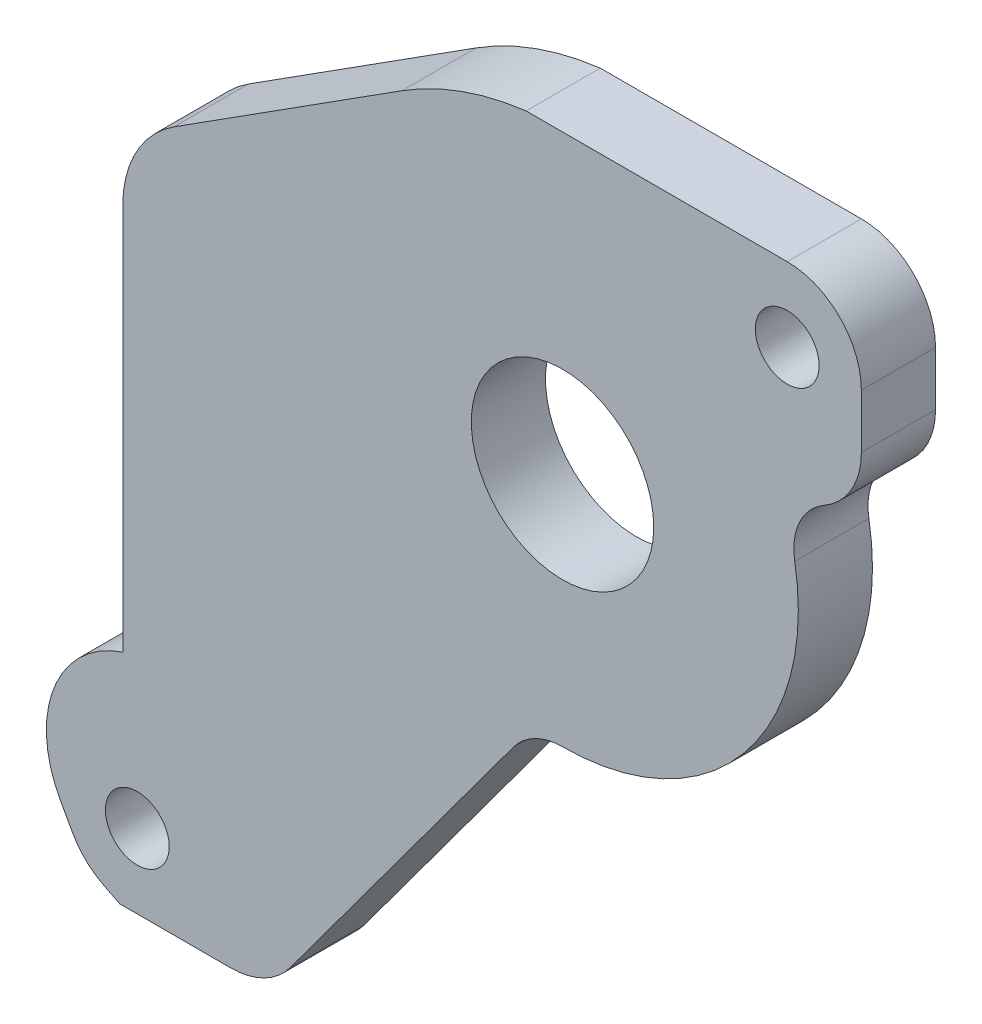
ISO-10303-21;
HEADER;
FILE_DESCRIPTION(('STEP AP214'),'2;1');
FILE_NAME('part.step','',(''),(''),'','','');
FILE_SCHEMA(('AUTOMOTIVE_DESIGN { 1 0 10303 214 1 1 1 1 }'));
ENDSEC;
DATA;
#1=APPLICATION_CONTEXT('core data for automotive mechanical design processes');
#2=APPLICATION_PROTOCOL_DEFINITION('international standard','automotive_design',2000,#1);
#3=PRODUCT_CONTEXT('',#1,'mechanical');
#4=PRODUCT('Part','Part','',(#3));
#5=PRODUCT_RELATED_PRODUCT_CATEGORY('part','',(#4));
#6=PRODUCT_DEFINITION_FORMATION('','',#4);
#7=PRODUCT_DEFINITION_CONTEXT('part definition',#1,'design');
#8=PRODUCT_DEFINITION('design','',#6,#7);
#9=PRODUCT_DEFINITION_SHAPE('','',#8);
#10=(LENGTH_UNIT() NAMED_UNIT(*) SI_UNIT(.MILLI.,.METRE.));
#11=(NAMED_UNIT(*) PLANE_ANGLE_UNIT() SI_UNIT($,.RADIAN.));
#12=(NAMED_UNIT(*) SI_UNIT($,.STERADIAN.) SOLID_ANGLE_UNIT());
#13=UNCERTAINTY_MEASURE_WITH_UNIT(LENGTH_MEASURE(1.E-05),#10,'distance_accuracy_value','');
#14=(GEOMETRIC_REPRESENTATION_CONTEXT(3) GLOBAL_UNCERTAINTY_ASSIGNED_CONTEXT((#13)) GLOBAL_UNIT_ASSIGNED_CONTEXT((#10,
#11,#12)) REPRESENTATION_CONTEXT('',''));
#15=CARTESIAN_POINT('',(0.,0.,0.));
#16=DIRECTION('',(0.,0.,1.));
#17=DIRECTION('',(1.,0.,0.));
#18=AXIS2_PLACEMENT_3D('',#15,#16,#17);
#19=CARTESIAN_POINT('',(0.,0.,5.));
#20=DIRECTION('',(0.,0.,1.));
#21=DIRECTION('',(1.,0.,0.));
#22=AXIS2_PLACEMENT_3D('',#19,#20,#21);
#23=PLANE('',#22);
#24=CARTESIAN_POINT('',(19.6961550602442,13.4729635533387,5.));
#25=DIRECTION('',(0.,0.,1.));
#26=DIRECTION('',(1.,0.,0.));
#27=AXIS2_PLACEMENT_3D('',#24,#25,#26);
#28=CIRCLE('',#27,4.1);
#29=CARTESIAN_POINT('',(17.6478873957385,17.0246673099238,5.));
#30=VERTEX_POINT('',#29);
#31=CARTESIAN_POINT('',(15.6584432728941,12.7610060249042,5.));
#32=VERTEX_POINT('',#31);
#33=EDGE_CURVE('E202',#30,#32,#28,.T.);
#34=ORIENTED_EDGE('',*,*,#33,.F.);
#35=CARTESIAN_POINT('',(15.15,21.3560133545398,5.));
#36=DIRECTION('',(0.,0.,1.));
#37=DIRECTION('',(1.,0.,0.));
#38=AXIS2_PLACEMENT_3D('',#35,#36,#37);
#39=CIRCLE('',#38,5.);
#40=CARTESIAN_POINT('',(20.15,21.3560133545398,5.));
#41=VERTEX_POINT('',#40);
#42=EDGE_CURVE('E71',#30,#41,#39,.T.);
#43=ORIENTED_EDGE('',*,*,#42,.T.);
#44=DIRECTION('',(0.,-1.,0.));
#45=VECTOR('',#44,1.);
#46=CARTESIAN_POINT('',(20.15,0.,5.));
#47=LINE('',#46,#45);
#48=CARTESIAN_POINT('',(20.15,25.,5.));
#49=VERTEX_POINT('',#48);
#50=EDGE_CURVE('E286',#49,#41,#47,.T.);
#51=ORIENTED_EDGE('',*,*,#50,.F.);
#52=CARTESIAN_POINT('',(15.15,25.,5.));
#53=DIRECTION('',(0.,0.,1.));
#54=DIRECTION('',(1.,0.,0.));
#55=AXIS2_PLACEMENT_3D('',#52,#53,#54);
#56=CIRCLE('',#55,5.);
#57=CARTESIAN_POINT('',(15.15,30.,5.));
#58=VERTEX_POINT('',#57);
#59=EDGE_CURVE('E267',#49,#58,#56,.T.);
#60=ORIENTED_EDGE('',*,*,#59,.T.);
#61=DIRECTION('',(1.,0.,0.));
#62=VECTOR('',#61,1.);
#63=CARTESIAN_POINT('',(0.,30.,5.));
#64=LINE('',#63,#62);
#65=CARTESIAN_POINT('',(-2.45407823836146,30.,5.));
#66=VERTEX_POINT('',#65);
#67=EDGE_CURVE('E288',#66,#58,#64,.T.);
#68=ORIENTED_EDGE('',*,*,#67,.F.);
#69=CARTESIAN_POINT('',(0.,9.99999999999999,5.));
#70=DIRECTION('',(0.,0.,1.));
#71=DIRECTION('',(1.,0.,0.));
#72=AXIS2_PLACEMENT_3D('',#69,#70,#71);
#73=CIRCLE('',#72,20.15);
#74=CARTESIAN_POINT('',(-10.828193198281,26.9933143341933,5.));
#75=VERTEX_POINT('',#74);
#76=EDGE_CURVE('E213',#66,#75,#73,.T.);
#77=ORIENTED_EDGE('',*,*,#76,.T.);
#78=DIRECTION('',(0.843340661746567,0.537379315051168,0.));
#79=VECTOR('',#78,1.);
#80=CARTESIAN_POINT('',(-15.3601314699227,24.1055490517447,5.));
#81=LINE('',#80,#79);
#82=CARTESIAN_POINT('',(-26.1803448628838,17.2108751369652,5.));
#83=VERTEX_POINT('',#82);
#84=EDGE_CURVE('E220',#83,#75,#81,.T.);
#85=ORIENTED_EDGE('',*,*,#84,.F.);
#86=CARTESIAN_POINT('',(-22.15,10.885820173866,5.));
#87=DIRECTION('',(0.,0.,1.));
#88=DIRECTION('',(1.,0.,0.));
#89=AXIS2_PLACEMENT_3D('',#86,#87,#88);
#90=CIRCLE('',#89,7.5);
#91=CARTESIAN_POINT('',(-29.65,10.885820173866,5.));
#92=VERTEX_POINT('',#91);
#93=EDGE_CURVE('E297',#83,#92,#90,.T.);
#94=ORIENTED_EDGE('',*,*,#93,.T.);
#95=DIRECTION('',(0.,-1.,0.));
#96=VECTOR('',#95,1.);
#97=CARTESIAN_POINT('',(-29.65,0.,5.));
#98=LINE('',#97,#96);
#99=CARTESIAN_POINT('',(-29.65,-15.2,5.));
#100=VERTEX_POINT('',#99);
#101=EDGE_CURVE('E237',#92,#100,#98,.T.);
#102=ORIENTED_EDGE('',*,*,#101,.T.);
#103=CARTESIAN_POINT('',(-27.2993967453016,-22.3221249876003,5.));
#104=DIRECTION('',(0.,0.,1.));
#105=DIRECTION('',(1.,0.,0.));
#106=AXIS2_PLACEMENT_3D('',#103,#104,#105);
#107=CIRCLE('',#106,7.5);
#108=CARTESIAN_POINT('',(-33.8519109527962,-25.9710368199938,5.));
#109=VERTEX_POINT('',#108);
#110=EDGE_CURVE('E307',#100,#109,#107,.T.);
#111=ORIENTED_EDGE('',*,*,#110,.T.);
#112=DIRECTION('',(0.486521577652461,-0.873668560999285,0.));
#113=VECTOR('',#112,1.);
#114=CARTESIAN_POINT('',(-36.8782664869401,-20.5364748066386,5.));
#115=LINE('',#114,#113);
#116=CARTESIAN_POINT('',(-33.0380029174975,-27.4326078882623,5.));
#117=VERTEX_POINT('',#116);
#118=EDGE_CURVE('E235',#109,#117,#115,.T.);
#119=ORIENTED_EDGE('',*,*,#118,.T.);
#120=CARTESIAN_POINT('',(-28.6696601125011,-25.,5.));
#121=DIRECTION('',(0.,0.,1.));
#122=DIRECTION('',(1.,0.,0.));
#123=AXIS2_PLACEMENT_3D('',#120,#121,#122);
#124=CIRCLE('',#123,5.);
#125=CARTESIAN_POINT('',(-30.9057280900008,-29.4721359549996,5.));
#126=VERTEX_POINT('',#125);
#127=EDGE_CURVE('E232',#117,#126,#124,.T.);
#128=ORIENTED_EDGE('',*,*,#127,.T.);
#129=DIRECTION('',(0.894427190999916,-0.447213595499958,0.));
#130=VECTOR('',#129,1.);
#131=CARTESIAN_POINT('',(-17.97,-35.94,5.));
#132=LINE('',#131,#130);
#133=CARTESIAN_POINT('',(-29.85,-30.,5.));
#134=VERTEX_POINT('',#133);
#135=EDGE_CURVE('E258',#126,#134,#132,.T.);
#136=ORIENTED_EDGE('',*,*,#135,.T.);
#137=DIRECTION('',(1.,0.,0.));
#138=VECTOR('',#137,1.);
#139=CARTESIAN_POINT('',(0.,-30.,5.));
#140=LINE('',#139,#138);
#141=CARTESIAN_POINT('',(-22.3746953353688,-30.,5.));
#142=VERTEX_POINT('',#141);
#143=EDGE_CURVE('E291',#134,#142,#140,.T.);
#144=ORIENTED_EDGE('',*,*,#143,.T.);
#145=CARTESIAN_POINT('',(-22.3746953353688,-25.,5.));
#146=DIRECTION('',(0.,0.,1.));
#147=DIRECTION('',(1.,0.,0.));
#148=AXIS2_PLACEMENT_3D('',#145,#146,#147);
#149=CIRCLE('',#148,5.);
#150=CARTESIAN_POINT('',(-18.3511593314807,-27.968359483859,5.));
#151=VERTEX_POINT('',#150);
#152=EDGE_CURVE('E323',#142,#151,#149,.T.);
#153=ORIENTED_EDGE('',*,*,#152,.T.);
#154=DIRECTION('',(0.593671896771801,0.804707200777632,0.));
#155=VECTOR('',#154,1.);
#156=CARTESIAN_POINT('',(1.47802097912755,-1.0904084334019,5.));
#157=LINE('',#156,#155);
#158=CARTESIAN_POINT('',(-3.29929952318829,-7.56594522323563,5.));
#159=VERTEX_POINT('',#158);
#160=EDGE_CURVE('E208',#151,#159,#157,.T.);
#161=ORIENTED_EDGE('',*,*,#160,.T.);
#162=CARTESIAN_POINT('',(0.,-10.,5.));
#163=DIRECTION('',(0.,0.,1.));
#164=DIRECTION('',(1.,0.,0.));
#165=AXIS2_PLACEMENT_3D('',#162,#163,#164);
#166=CIRCLE('',#165,4.1);
#167=CARTESIAN_POINT('',(0.,-5.90000000000001,5.));
#168=VERTEX_POINT('',#167);
#169=EDGE_CURVE('E193',#168,#159,#166,.T.);
#170=ORIENTED_EDGE('',*,*,#169,.F.);
#171=CARTESIAN_POINT('',(0.,9.99999999999999,5.));
#172=DIRECTION('',(0.,0.,1.));
#173=DIRECTION('',(1.,0.,0.));
#174=AXIS2_PLACEMENT_3D('',#171,#172,#173);
#175=CIRCLE('',#174,15.9);
#176=EDGE_CURVE('E199',#168,#32,#175,.T.);
#177=ORIENTED_EDGE('',*,*,#176,.T.);
#178=EDGE_LOOP('',(#34,#43,#51,#60,#68,#77,#85,#94,#102,#111,#119,#128,#136,#144,#153,#161,#170,#177));
#179=FACE_BOUND('',#178,.T.);
#180=CARTESIAN_POINT('',(0.,9.99999999999999,5.));
#181=DIRECTION('',(0.,0.,1.));
#182=DIRECTION('',(1.,0.,0.));
#183=AXIS2_PLACEMENT_3D('',#180,#181,#182);
#184=CIRCLE('',#183,6.15);
#185=CARTESIAN_POINT('',(6.15,9.99999999999999,5.));
#186=VERTEX_POINT('',#185);
#187=EDGE_CURVE('E294',#186,#186,#184,.T.);
#188=ORIENTED_EDGE('',*,*,#187,.F.);
#189=EDGE_LOOP('',(#188));
#190=FACE_BOUND('',#189,.T.);
#191=CARTESIAN_POINT('',(15.15,25.,5.));
#192=DIRECTION('',(0.,0.,1.));
#193=DIRECTION('',(1.,0.,0.));
#194=AXIS2_PLACEMENT_3D('',#191,#192,#193);
#195=CIRCLE('',#194,2.15);
#196=CARTESIAN_POINT('',(17.3,25.,5.));
#197=VERTEX_POINT('',#196);
#198=EDGE_CURVE('E277',#197,#197,#195,.T.);
#199=ORIENTED_EDGE('',*,*,#198,.F.);
#200=EDGE_LOOP('',(#199));
#201=FACE_BOUND('',#200,.T.);
#202=CARTESIAN_POINT('',(-28.6696601125011,-25.,5.));
#203=DIRECTION('',(0.,0.,1.));
#204=DIRECTION('',(1.,0.,0.));
#205=AXIS2_PLACEMENT_3D('',#202,#203,#204);
#206=CIRCLE('',#205,2.15);
#207=CARTESIAN_POINT('',(-26.5196601125011,-25.,5.));
#208=VERTEX_POINT('',#207);
#209=EDGE_CURVE('E244',#208,#208,#206,.T.);
#210=ORIENTED_EDGE('',*,*,#209,.F.);
#211=EDGE_LOOP('',(#210));
#212=FACE_BOUND('',#211,.T.);
#213=ADVANCED_FACE('F49',(#179,#190,#201,#212),#23,.T.);
#214=CARTESIAN_POINT('',(0.,0.,0.));
#215=DIRECTION('',(0.,0.,1.));
#216=DIRECTION('',(1.,0.,0.));
#217=AXIS2_PLACEMENT_3D('',#214,#215,#216);
#218=PLANE('',#217);
#219=CARTESIAN_POINT('',(0.,9.99999999999999,0.));
#220=DIRECTION('',(0.,0.,1.));
#221=DIRECTION('',(1.,0.,0.));
#222=AXIS2_PLACEMENT_3D('',#219,#220,#221);
#223=CIRCLE('',#222,6.15);
#224=CARTESIAN_POINT('',(6.15,9.99999999999999,0.));
#225=VERTEX_POINT('',#224);
#226=EDGE_CURVE('E289',#225,#225,#223,.T.);
#227=ORIENTED_EDGE('',*,*,#226,.T.);
#228=EDGE_LOOP('',(#227));
#229=FACE_BOUND('',#228,.T.);
#230=CARTESIAN_POINT('',(15.15,25.,0.));
#231=DIRECTION('',(0.,0.,1.));
#232=DIRECTION('',(1.,0.,0.));
#233=AXIS2_PLACEMENT_3D('',#230,#231,#232);
#234=CIRCLE('',#233,2.15);
#235=CARTESIAN_POINT('',(17.3,25.,0.));
#236=VERTEX_POINT('',#235);
#237=EDGE_CURVE('E280',#236,#236,#234,.T.);
#238=ORIENTED_EDGE('',*,*,#237,.T.);
#239=EDGE_LOOP('',(#238));
#240=FACE_BOUND('',#239,.T.);
#241=CARTESIAN_POINT('',(-28.6696601125011,-25.,0.));
#242=DIRECTION('',(0.,0.,1.));
#243=DIRECTION('',(1.,0.,0.));
#244=AXIS2_PLACEMENT_3D('',#241,#242,#243);
#245=CIRCLE('',#244,2.15);
#246=CARTESIAN_POINT('',(-26.5196601125011,-25.,0.));
#247=VERTEX_POINT('',#246);
#248=EDGE_CURVE('E255',#247,#247,#245,.T.);
#249=ORIENTED_EDGE('',*,*,#248,.T.);
#250=EDGE_LOOP('',(#249));
#251=FACE_BOUND('',#250,.T.);
#252=DIRECTION('',(0.,-1.,0.));
#253=VECTOR('',#252,1.);
#254=CARTESIAN_POINT('',(20.15,0.,0.));
#255=LINE('',#254,#253);
#256=CARTESIAN_POINT('',(20.15,25.,0.));
#257=VERTEX_POINT('',#256);
#258=CARTESIAN_POINT('',(20.15,21.3560133545398,0.));
#259=VERTEX_POINT('',#258);
#260=EDGE_CURVE('E283',#257,#259,#255,.T.);
#261=ORIENTED_EDGE('',*,*,#260,.T.);
#262=CARTESIAN_POINT('',(15.15,21.3560133545398,0.));
#263=DIRECTION('',(0.,0.,1.));
#264=DIRECTION('',(1.,0.,0.));
#265=AXIS2_PLACEMENT_3D('',#262,#263,#264);
#266=CIRCLE('',#265,5.);
#267=CARTESIAN_POINT('',(17.6478873957385,17.0246673099238,0.));
#268=VERTEX_POINT('',#267);
#269=EDGE_CURVE('E12',#259,#268,#266,.F.);
#270=ORIENTED_EDGE('',*,*,#269,.T.);
#271=CARTESIAN_POINT('',(19.6961550602442,13.4729635533387,0.));
#272=DIRECTION('',(0.,0.,1.));
#273=DIRECTION('',(1.,0.,0.));
#274=AXIS2_PLACEMENT_3D('',#271,#272,#273);
#275=CIRCLE('',#274,4.1);
#276=CARTESIAN_POINT('',(15.6584432728941,12.7610060249042,0.));
#277=VERTEX_POINT('',#276);
#278=EDGE_CURVE('E185',#268,#277,#275,.T.);
#279=ORIENTED_EDGE('',*,*,#278,.T.);
#280=CARTESIAN_POINT('',(0.,9.99999999999999,0.));
#281=DIRECTION('',(0.,0.,1.));
#282=DIRECTION('',(1.,0.,0.));
#283=AXIS2_PLACEMENT_3D('',#280,#281,#282);
#284=CIRCLE('',#283,15.9);
#285=CARTESIAN_POINT('',(0.,-5.90000000000001,0.));
#286=VERTEX_POINT('',#285);
#287=EDGE_CURVE('E195',#286,#277,#284,.T.);
#288=ORIENTED_EDGE('',*,*,#287,.F.);
#289=CARTESIAN_POINT('',(0.,-10.,0.));
#290=DIRECTION('',(0.,0.,1.));
#291=DIRECTION('',(1.,0.,0.));
#292=AXIS2_PLACEMENT_3D('',#289,#290,#291);
#293=CIRCLE('',#292,4.1);
#294=CARTESIAN_POINT('',(-3.29929952318829,-7.56594522323563,0.));
#295=VERTEX_POINT('',#294);
#296=EDGE_CURVE('E186',#286,#295,#293,.T.);
#297=ORIENTED_EDGE('',*,*,#296,.T.);
#298=DIRECTION('',(0.593671896771801,0.804707200777632,0.));
#299=VECTOR('',#298,1.);
#300=CARTESIAN_POINT('',(1.47802097912755,-1.0904084334019,0.));
#301=LINE('',#300,#299);
#302=CARTESIAN_POINT('',(-18.3511593314807,-27.968359483859,0.));
#303=VERTEX_POINT('',#302);
#304=EDGE_CURVE('E174',#303,#295,#301,.T.);
#305=ORIENTED_EDGE('',*,*,#304,.F.);
#306=CARTESIAN_POINT('',(-22.3746953353688,-25.,0.));
#307=DIRECTION('',(0.,0.,1.));
#308=DIRECTION('',(1.,0.,0.));
#309=AXIS2_PLACEMENT_3D('',#306,#307,#308);
#310=CIRCLE('',#309,5.);
#311=CARTESIAN_POINT('',(-22.3746953353688,-30.,0.));
#312=VERTEX_POINT('',#311);
#313=EDGE_CURVE('E326',#303,#312,#310,.F.);
#314=ORIENTED_EDGE('',*,*,#313,.T.);
#315=DIRECTION('',(1.,0.,0.));
#316=VECTOR('',#315,1.);
#317=CARTESIAN_POINT('',(0.,-30.,0.));
#318=LINE('',#317,#316);
#319=CARTESIAN_POINT('',(-29.85,-30.,0.));
#320=VERTEX_POINT('',#319);
#321=EDGE_CURVE('E301',#320,#312,#318,.T.);
#322=ORIENTED_EDGE('',*,*,#321,.F.);
#323=DIRECTION('',(0.894427190999916,-0.447213595499958,0.));
#324=VECTOR('',#323,1.);
#325=CARTESIAN_POINT('',(-17.97,-35.94,0.));
#326=LINE('',#325,#324);
#327=CARTESIAN_POINT('',(-30.9057280900009,-29.4721359549996,0.));
#328=VERTEX_POINT('',#327);
#329=EDGE_CURVE('E261',#328,#320,#326,.T.);
#330=ORIENTED_EDGE('',*,*,#329,.F.);
#331=CARTESIAN_POINT('',(-28.6696601125011,-25.,0.));
#332=DIRECTION('',(0.,0.,1.));
#333=DIRECTION('',(1.,0.,0.));
#334=AXIS2_PLACEMENT_3D('',#331,#332,#333);
#335=CIRCLE('',#334,5.);
#336=CARTESIAN_POINT('',(-33.0380029174975,-27.4326078882623,0.));
#337=VERTEX_POINT('',#336);
#338=EDGE_CURVE('E219',#337,#328,#335,.T.);
#339=ORIENTED_EDGE('',*,*,#338,.F.);
#340=DIRECTION('',(0.486521577652461,-0.873668560999285,0.));
#341=VECTOR('',#340,1.);
#342=CARTESIAN_POINT('',(-36.8782664869401,-20.5364748066386,0.));
#343=LINE('',#342,#341);
#344=CARTESIAN_POINT('',(-33.8519109527962,-25.9710368199938,0.));
#345=VERTEX_POINT('',#344);
#346=EDGE_CURVE('E222',#345,#337,#343,.T.);
#347=ORIENTED_EDGE('',*,*,#346,.F.);
#348=CARTESIAN_POINT('',(-27.2993967453016,-22.3221249876003,0.));
#349=DIRECTION('',(0.,0.,1.));
#350=DIRECTION('',(1.,0.,0.));
#351=AXIS2_PLACEMENT_3D('',#348,#349,#350);
#352=CIRCLE('',#351,7.5);
#353=CARTESIAN_POINT('',(-29.65,-15.2,0.));
#354=VERTEX_POINT('',#353);
#355=EDGE_CURVE('E313',#345,#354,#352,.F.);
#356=ORIENTED_EDGE('',*,*,#355,.T.);
#357=DIRECTION('',(0.,-1.,0.));
#358=VECTOR('',#357,1.);
#359=CARTESIAN_POINT('',(-29.65,0.,0.));
#360=LINE('',#359,#358);
#361=CARTESIAN_POINT('',(-29.65,10.885820173866,0.));
#362=VERTEX_POINT('',#361);
#363=EDGE_CURVE('E224',#362,#354,#360,.T.);
#364=ORIENTED_EDGE('',*,*,#363,.F.);
#365=CARTESIAN_POINT('',(-22.15,10.885820173866,0.));
#366=DIRECTION('',(0.,0.,1.));
#367=DIRECTION('',(1.,0.,0.));
#368=AXIS2_PLACEMENT_3D('',#365,#366,#367);
#369=CIRCLE('',#368,7.5);
#370=CARTESIAN_POINT('',(-26.1803448628838,17.2108751369652,0.));
#371=VERTEX_POINT('',#370);
#372=EDGE_CURVE('E311',#362,#371,#369,.F.);
#373=ORIENTED_EDGE('',*,*,#372,.T.);
#374=DIRECTION('',(0.843340661746567,0.537379315051168,0.));
#375=VECTOR('',#374,1.);
#376=CARTESIAN_POINT('',(-15.3601314699227,24.1055490517447,0.));
#377=LINE('',#376,#375);
#378=CARTESIAN_POINT('',(-10.828193198281,26.9933143341933,0.));
#379=VERTEX_POINT('',#378);
#380=EDGE_CURVE('E227',#371,#379,#377,.T.);
#381=ORIENTED_EDGE('',*,*,#380,.T.);
#382=CARTESIAN_POINT('',(0.,9.99999999999999,0.));
#383=DIRECTION('',(0.,0.,1.));
#384=DIRECTION('',(1.,0.,0.));
#385=AXIS2_PLACEMENT_3D('',#382,#383,#384);
#386=CIRCLE('',#385,20.15);
#387=CARTESIAN_POINT('',(-2.45407823836146,30.,0.));
#388=VERTEX_POINT('',#387);
#389=EDGE_CURVE('E216',#388,#379,#386,.T.);
#390=ORIENTED_EDGE('',*,*,#389,.F.);
#391=DIRECTION('',(1.,0.,0.));
#392=VECTOR('',#391,1.);
#393=CARTESIAN_POINT('',(0.,30.,0.));
#394=LINE('',#393,#392);
#395=CARTESIAN_POINT('',(15.15,30.,0.));
#396=VERTEX_POINT('',#395);
#397=EDGE_CURVE('E299',#388,#396,#394,.T.);
#398=ORIENTED_EDGE('',*,*,#397,.T.);
#399=CARTESIAN_POINT('',(15.15,25.,0.));
#400=DIRECTION('',(0.,0.,1.));
#401=DIRECTION('',(1.,0.,0.));
#402=AXIS2_PLACEMENT_3D('',#399,#400,#401);
#403=CIRCLE('',#402,5.);
#404=EDGE_CURVE('E268',#257,#396,#403,.T.);
#405=ORIENTED_EDGE('',*,*,#404,.F.);
#406=EDGE_LOOP('',(#261,#270,#279,#288,#297,#305,#314,#322,#330,#339,#347,#356,#364,#373,#381,
#390,#398,#405));
#407=FACE_BOUND('',#406,.T.);
#408=ADVANCED_FACE('F197',(#229,#240,#251,#407),#218,.F.);
#409=CARTESIAN_POINT('',(0.,30.,5.));
#410=DIRECTION('',(0.,1.,0.));
#411=DIRECTION('',(0.,0.,1.));
#412=AXIS2_PLACEMENT_3D('',#409,#410,#411);
#413=PLANE('',#412);
#414=ORIENTED_EDGE('',*,*,#397,.F.);
#415=DIRECTION('',(0.,0.,1.));
#416=VECTOR('',#415,1.);
#417=CARTESIAN_POINT('',(-2.45407823836146,30.,0.));
#418=LINE('',#417,#416);
#419=EDGE_CURVE('E229',#388,#66,#418,.T.);
#420=ORIENTED_EDGE('',*,*,#419,.T.);
#421=ORIENTED_EDGE('',*,*,#67,.T.);
#422=DIRECTION('',(0.,0.,1.));
#423=VECTOR('',#422,1.);
#424=CARTESIAN_POINT('',(15.15,30.,0.));
#425=LINE('',#424,#423);
#426=EDGE_CURVE('E274',#396,#58,#425,.T.);
#427=ORIENTED_EDGE('',*,*,#426,.F.);
#428=EDGE_LOOP('',(#414,#420,#421,#427));
#429=FACE_BOUND('',#428,.T.);
#430=ADVANCED_FACE('F356',(#429),#413,.T.);
#431=CARTESIAN_POINT('',(0.,-30.,5.));
#432=DIRECTION('',(0.,1.,0.));
#433=DIRECTION('',(0.,0.,1.));
#434=AXIS2_PLACEMENT_3D('',#431,#432,#433);
#435=PLANE('',#434);
#436=ORIENTED_EDGE('',*,*,#321,.T.);
#437=DIRECTION('',(0.,0.,1.));
#438=VECTOR('',#437,1.);
#439=CARTESIAN_POINT('',(-22.3746953353688,-30.,5.));
#440=LINE('',#439,#438);
#441=EDGE_CURVE('E320',#312,#142,#440,.T.);
#442=ORIENTED_EDGE('',*,*,#441,.T.);
#443=ORIENTED_EDGE('',*,*,#143,.F.);
#444=DIRECTION('',(0.,0.,1.));
#445=VECTOR('',#444,1.);
#446=CARTESIAN_POINT('',(-29.85,-30.,0.));
#447=LINE('',#446,#445);
#448=EDGE_CURVE('E263',#320,#134,#447,.T.);
#449=ORIENTED_EDGE('',*,*,#448,.F.);
#450=EDGE_LOOP('',(#436,#442,#443,#449));
#451=FACE_BOUND('',#450,.T.);
#452=ADVANCED_FACE('F368',(#451),#435,.F.);
#453=CARTESIAN_POINT('',(20.15,0.,5.));
#454=DIRECTION('',(1.,0.,0.));
#455=DIRECTION('',(0.,1.,0.));
#456=AXIS2_PLACEMENT_3D('',#453,#454,#455);
#457=PLANE('',#456);
#458=ORIENTED_EDGE('',*,*,#50,.T.);
#459=DIRECTION('',(0.,0.,-1.));
#460=VECTOR('',#459,1.);
#461=CARTESIAN_POINT('',(20.15,21.3560133545398,0.));
#462=LINE('',#461,#460);
#463=EDGE_CURVE('E57',#41,#259,#462,.T.);
#464=ORIENTED_EDGE('',*,*,#463,.T.);
#465=ORIENTED_EDGE('',*,*,#260,.F.);
#466=DIRECTION('',(0.,0.,1.));
#467=VECTOR('',#466,1.);
#468=CARTESIAN_POINT('',(20.15,25.,0.));
#469=LINE('',#468,#467);
#470=EDGE_CURVE('E271',#257,#49,#469,.T.);
#471=ORIENTED_EDGE('',*,*,#470,.T.);
#472=EDGE_LOOP('',(#458,#464,#465,#471));
#473=FACE_BOUND('',#472,.T.);
#474=ADVANCED_FACE('F366',(#473),#457,.T.);
#475=CARTESIAN_POINT('',(0.,9.99999999999999,5.));
#476=DIRECTION('',(0.,0.,-1.));
#477=DIRECTION('',(-1.,0.,0.));
#478=AXIS2_PLACEMENT_3D('',#475,#476,#477);
#479=CYLINDRICAL_SURFACE('',#478,6.15);
#480=ORIENTED_EDGE('',*,*,#187,.T.);
#481=EDGE_LOOP('',(#480));
#482=FACE_BOUND('',#481,.T.);
#483=ORIENTED_EDGE('',*,*,#226,.F.);
#484=EDGE_LOOP('',(#483));
#485=FACE_BOUND('',#484,.T.);
#486=ADVANCED_FACE('F363',(#482,#485),#479,.F.);
#487=CARTESIAN_POINT('',(15.15,25.,0.));
#488=DIRECTION('',(0.,0.,1.));
#489=DIRECTION('',(1.,0.,0.));
#490=AXIS2_PLACEMENT_3D('',#487,#488,#489);
#491=CYLINDRICAL_SURFACE('',#490,2.15);
#492=ORIENTED_EDGE('',*,*,#237,.F.);
#493=EDGE_LOOP('',(#492));
#494=FACE_BOUND('',#493,.T.);
#495=ORIENTED_EDGE('',*,*,#198,.T.);
#496=EDGE_LOOP('',(#495));
#497=FACE_BOUND('',#496,.T.);
#498=ADVANCED_FACE('F360',(#494,#497),#491,.F.);
#499=CARTESIAN_POINT('',(15.15,25.,0.));
#500=DIRECTION('',(0.,0.,1.));
#501=DIRECTION('',(1.,0.,0.));
#502=AXIS2_PLACEMENT_3D('',#499,#500,#501);
#503=CYLINDRICAL_SURFACE('',#502,5.);
#504=ORIENTED_EDGE('',*,*,#59,.F.);
#505=ORIENTED_EDGE('',*,*,#470,.F.);
#506=ORIENTED_EDGE('',*,*,#404,.T.);
#507=ORIENTED_EDGE('',*,*,#426,.T.);
#508=EDGE_LOOP('',(#504,#505,#506,#507));
#509=FACE_BOUND('',#508,.T.);
#510=ADVANCED_FACE('F431',(#509),#503,.T.);
#511=CARTESIAN_POINT('',(-17.97,-35.94,0.));
#512=DIRECTION('',(-0.447213595499958,-0.894427190999916,0.));
#513=DIRECTION('',(0.894427190999916,-0.447213595499958,0.));
#514=AXIS2_PLACEMENT_3D('',#511,#512,#513);
#515=PLANE('',#514);
#516=DIRECTION('',(0.,0.,1.));
#517=VECTOR('',#516,1.);
#518=CARTESIAN_POINT('',(-30.9057280900008,-29.4721359549996,0.));
#519=LINE('',#518,#517);
#520=EDGE_CURVE('E251',#328,#126,#519,.T.);
#521=ORIENTED_EDGE('',*,*,#520,.F.);
#522=ORIENTED_EDGE('',*,*,#329,.T.);
#523=ORIENTED_EDGE('',*,*,#448,.T.);
#524=ORIENTED_EDGE('',*,*,#135,.F.);
#525=EDGE_LOOP('',(#521,#522,#523,#524));
#526=FACE_BOUND('',#525,.T.);
#527=ADVANCED_FACE('F400',(#526),#515,.T.);
#528=CARTESIAN_POINT('',(-28.6696601125011,-25.,0.));
#529=DIRECTION('',(0.,0.,1.));
#530=DIRECTION('',(1.,0.,0.));
#531=AXIS2_PLACEMENT_3D('',#528,#529,#530);
#532=CYLINDRICAL_SURFACE('',#531,2.15);
#533=ORIENTED_EDGE('',*,*,#248,.F.);
#534=EDGE_LOOP('',(#533));
#535=FACE_BOUND('',#534,.T.);
#536=ORIENTED_EDGE('',*,*,#209,.T.);
#537=EDGE_LOOP('',(#536));
#538=FACE_BOUND('',#537,.T.);
#539=ADVANCED_FACE('F438',(#535,#538),#532,.F.);
#540=CARTESIAN_POINT('',(0.,9.99999999999999,0.));
#541=DIRECTION('',(0.,0.,1.));
#542=DIRECTION('',(1.,0.,0.));
#543=AXIS2_PLACEMENT_3D('',#540,#541,#542);
#544=CYLINDRICAL_SURFACE('',#543,20.15);
#545=ORIENTED_EDGE('',*,*,#76,.F.);
#546=ORIENTED_EDGE('',*,*,#419,.F.);
#547=ORIENTED_EDGE('',*,*,#389,.T.);
#548=DIRECTION('',(0.,0.,1.));
#549=VECTOR('',#548,1.);
#550=CARTESIAN_POINT('',(-10.828193198281,26.9933143341933,0.));
#551=LINE('',#550,#549);
#552=EDGE_CURVE('E241',#379,#75,#551,.T.);
#553=ORIENTED_EDGE('',*,*,#552,.T.);
#554=EDGE_LOOP('',(#545,#546,#547,#553));
#555=FACE_BOUND('',#554,.T.);
#556=ADVANCED_FACE('F426',(#555),#544,.T.);
#557=CARTESIAN_POINT('',(-15.3601314699227,24.1055490517447,0.));
#558=DIRECTION('',(0.537379315051168,-0.843340661746567,0.));
#559=DIRECTION('',(0.843340661746567,0.537379315051168,0.));
#560=AXIS2_PLACEMENT_3D('',#557,#558,#559);
#561=PLANE('',#560);
#562=ORIENTED_EDGE('',*,*,#380,.F.);
#563=DIRECTION('',(0.,0.,1.));
#564=VECTOR('',#563,1.);
#565=CARTESIAN_POINT('',(-26.1803448628838,17.2108751369652,5.));
#566=LINE('',#565,#564);
#567=EDGE_CURVE('E315',#371,#83,#566,.T.);
#568=ORIENTED_EDGE('',*,*,#567,.T.);
#569=ORIENTED_EDGE('',*,*,#84,.T.);
#570=ORIENTED_EDGE('',*,*,#552,.F.);
#571=EDGE_LOOP('',(#562,#568,#569,#570));
#572=FACE_BOUND('',#571,.T.);
#573=ADVANCED_FACE('F423',(#572),#561,.F.);
#574=CARTESIAN_POINT('',(-29.65,0.,0.));
#575=DIRECTION('',(-1.,0.,0.));
#576=DIRECTION('',(0.,-1.,0.));
#577=AXIS2_PLACEMENT_3D('',#574,#575,#576);
#578=PLANE('',#577);
#579=ORIENTED_EDGE('',*,*,#101,.F.);
#580=DIRECTION('',(0.,0.,1.));
#581=VECTOR('',#580,1.);
#582=CARTESIAN_POINT('',(-29.65,10.885820173866,0.));
#583=LINE('',#582,#581);
#584=EDGE_CURVE('E318',#92,#362,#583,.F.);
#585=ORIENTED_EDGE('',*,*,#584,.T.);
#586=ORIENTED_EDGE('',*,*,#363,.T.);
#587=DIRECTION('',(0.,0.,1.));
#588=VECTOR('',#587,1.);
#589=CARTESIAN_POINT('',(-29.65,-15.2,0.));
#590=LINE('',#589,#588);
#591=EDGE_CURVE('E245',#354,#100,#590,.T.);
#592=ORIENTED_EDGE('',*,*,#591,.T.);
#593=EDGE_LOOP('',(#579,#585,#586,#592));
#594=FACE_BOUND('',#593,.T.);
#595=ADVANCED_FACE('F416',(#594),#578,.T.);
#596=CARTESIAN_POINT('',(-36.8782664869401,-20.5364748066386,0.));
#597=DIRECTION('',(-0.873668560999285,-0.486521577652461,0.));
#598=DIRECTION('',(0.486521577652461,-0.873668560999285,0.));
#599=AXIS2_PLACEMENT_3D('',#596,#597,#598);
#600=PLANE('',#599);
#601=ORIENTED_EDGE('',*,*,#118,.F.);
#602=DIRECTION('',(0.,0.,1.));
#603=VECTOR('',#602,1.);
#604=CARTESIAN_POINT('',(-33.8519109527962,-25.9710368199938,0.));
#605=LINE('',#604,#603);
#606=EDGE_CURVE('E309',#109,#345,#605,.F.);
#607=ORIENTED_EDGE('',*,*,#606,.T.);
#608=ORIENTED_EDGE('',*,*,#346,.T.);
#609=DIRECTION('',(0.,0.,1.));
#610=VECTOR('',#609,1.);
#611=CARTESIAN_POINT('',(-33.0380029174975,-27.4326078882623,0.));
#612=LINE('',#611,#610);
#613=EDGE_CURVE('E248',#337,#117,#612,.T.);
#614=ORIENTED_EDGE('',*,*,#613,.T.);
#615=EDGE_LOOP('',(#601,#607,#608,#614));
#616=FACE_BOUND('',#615,.T.);
#617=ADVANCED_FACE('F409',(#616),#600,.T.);
#618=CARTESIAN_POINT('',(-28.6696601125011,-25.,0.));
#619=DIRECTION('',(0.,0.,1.));
#620=DIRECTION('',(1.,0.,0.));
#621=AXIS2_PLACEMENT_3D('',#618,#619,#620);
#622=CYLINDRICAL_SURFACE('',#621,5.);
#623=ORIENTED_EDGE('',*,*,#127,.F.);
#624=ORIENTED_EDGE('',*,*,#613,.F.);
#625=ORIENTED_EDGE('',*,*,#338,.T.);
#626=ORIENTED_EDGE('',*,*,#520,.T.);
#627=EDGE_LOOP('',(#623,#624,#625,#626));
#628=FACE_BOUND('',#627,.T.);
#629=ADVANCED_FACE('F380',(#628),#622,.T.);
#630=CARTESIAN_POINT('',(-27.2993967453016,-22.3221249876003,0.));
#631=DIRECTION('',(0.,0.,-1.));
#632=DIRECTION('',(-1.,0.,0.));
#633=AXIS2_PLACEMENT_3D('',#630,#631,#632);
#634=CYLINDRICAL_SURFACE('',#633,7.5);
#635=ORIENTED_EDGE('',*,*,#355,.F.);
#636=ORIENTED_EDGE('',*,*,#606,.F.);
#637=ORIENTED_EDGE('',*,*,#110,.F.);
#638=ORIENTED_EDGE('',*,*,#591,.F.);
#639=EDGE_LOOP('',(#635,#636,#637,#638));
#640=FACE_BOUND('',#639,.T.);
#641=ADVANCED_FACE('F377',(#640),#634,.T.);
#642=CARTESIAN_POINT('',(-22.15,10.885820173866,0.));
#643=DIRECTION('',(0.,0.,-1.));
#644=DIRECTION('',(-1.,0.,0.));
#645=AXIS2_PLACEMENT_3D('',#642,#643,#644);
#646=CYLINDRICAL_SURFACE('',#645,7.5);
#647=ORIENTED_EDGE('',*,*,#372,.F.);
#648=ORIENTED_EDGE('',*,*,#584,.F.);
#649=ORIENTED_EDGE('',*,*,#93,.F.);
#650=ORIENTED_EDGE('',*,*,#567,.F.);
#651=EDGE_LOOP('',(#647,#648,#649,#650));
#652=FACE_BOUND('',#651,.T.);
#653=ADVANCED_FACE('F349',(#652),#646,.T.);
#654=CARTESIAN_POINT('',(0.,-10.,0.));
#655=DIRECTION('',(0.,0.,1.));
#656=DIRECTION('',(1.,0.,0.));
#657=AXIS2_PLACEMENT_3D('',#654,#655,#656);
#658=CYLINDRICAL_SURFACE('',#657,4.1);
#659=ORIENTED_EDGE('',*,*,#169,.T.);
#660=DIRECTION('',(0.,0.,1.));
#661=VECTOR('',#660,1.);
#662=CARTESIAN_POINT('',(-3.29929952318829,-7.56594522323563,0.));
#663=LINE('',#662,#661);
#664=EDGE_CURVE('E178',#295,#159,#663,.T.);
#665=ORIENTED_EDGE('',*,*,#664,.F.);
#666=ORIENTED_EDGE('',*,*,#296,.F.);
#667=DIRECTION('',(0.,0.,1.));
#668=VECTOR('',#667,1.);
#669=CARTESIAN_POINT('',(0.,-5.90000000000001,0.));
#670=LINE('',#669,#668);
#671=EDGE_CURVE('E211',#286,#168,#670,.T.);
#672=ORIENTED_EDGE('',*,*,#671,.T.);
#673=EDGE_LOOP('',(#659,#665,#666,#672));
#674=FACE_BOUND('',#673,.T.);
#675=ADVANCED_FACE('F190',(#674),#658,.F.);
#676=CARTESIAN_POINT('',(0.,9.99999999999999,0.));
#677=DIRECTION('',(0.,0.,1.));
#678=DIRECTION('',(1.,0.,0.));
#679=AXIS2_PLACEMENT_3D('',#676,#677,#678);
#680=CYLINDRICAL_SURFACE('',#679,15.9);
#681=ORIENTED_EDGE('',*,*,#176,.F.);
#682=ORIENTED_EDGE('',*,*,#671,.F.);
#683=ORIENTED_EDGE('',*,*,#287,.T.);
#684=DIRECTION('',(0.,0.,1.));
#685=VECTOR('',#684,1.);
#686=CARTESIAN_POINT('',(15.6584432728941,12.7610060249042,0.));
#687=LINE('',#686,#685);
#688=EDGE_CURVE('E194',#277,#32,#687,.T.);
#689=ORIENTED_EDGE('',*,*,#688,.T.);
#690=EDGE_LOOP('',(#681,#682,#683,#689));
#691=FACE_BOUND('',#690,.T.);
#692=ADVANCED_FACE('F341',(#691),#680,.T.);
#693=CARTESIAN_POINT('',(19.6961550602442,13.4729635533387,0.));
#694=DIRECTION('',(0.,0.,1.));
#695=DIRECTION('',(1.,0.,0.));
#696=AXIS2_PLACEMENT_3D('',#693,#694,#695);
#697=CYLINDRICAL_SURFACE('',#696,4.1);
#698=ORIENTED_EDGE('',*,*,#278,.F.);
#699=DIRECTION('',(0.,0.,1.));
#700=VECTOR('',#699,1.);
#701=CARTESIAN_POINT('',(17.6478873957385,17.0246673099238,0.));
#702=LINE('',#701,#700);
#703=EDGE_CURVE('E328',#268,#30,#702,.T.);
#704=ORIENTED_EDGE('',*,*,#703,.T.);
#705=ORIENTED_EDGE('',*,*,#33,.T.);
#706=ORIENTED_EDGE('',*,*,#688,.F.);
#707=EDGE_LOOP('',(#698,#704,#705,#706));
#708=FACE_BOUND('',#707,.T.);
#709=ADVANCED_FACE('F334',(#708),#697,.F.);
#710=CARTESIAN_POINT('',(1.47802097912755,-1.0904084334019,0.));
#711=DIRECTION('',(0.804707200777632,-0.593671896771801,0.));
#712=DIRECTION('',(0.593671896771801,0.804707200777632,0.));
#713=AXIS2_PLACEMENT_3D('',#710,#711,#712);
#714=PLANE('',#713);
#715=ORIENTED_EDGE('',*,*,#160,.F.);
#716=DIRECTION('',(0.,0.,1.));
#717=VECTOR('',#716,1.);
#718=CARTESIAN_POINT('',(-18.3511593314807,-27.968359483859,0.));
#719=LINE('',#718,#717);
#720=EDGE_CURVE('E181',#151,#303,#719,.F.);
#721=ORIENTED_EDGE('',*,*,#720,.T.);
#722=ORIENTED_EDGE('',*,*,#304,.T.);
#723=ORIENTED_EDGE('',*,*,#664,.T.);
#724=EDGE_LOOP('',(#715,#721,#722,#723));
#725=FACE_BOUND('',#724,.T.);
#726=ADVANCED_FACE('F177',(#725),#714,.T.);
#727=CARTESIAN_POINT('',(-22.3746953353688,-25.,5.));
#728=DIRECTION('',(0.,0.,-1.));
#729=DIRECTION('',(-1.,0.,0.));
#730=AXIS2_PLACEMENT_3D('',#727,#728,#729);
#731=CYLINDRICAL_SURFACE('',#730,5.);
#732=ORIENTED_EDGE('',*,*,#313,.F.);
#733=ORIENTED_EDGE('',*,*,#720,.F.);
#734=ORIENTED_EDGE('',*,*,#152,.F.);
#735=ORIENTED_EDGE('',*,*,#441,.F.);
#736=EDGE_LOOP('',(#732,#733,#734,#735));
#737=FACE_BOUND('',#736,.T.);
#738=ADVANCED_FACE('F384',(#737),#731,.T.);
#739=CARTESIAN_POINT('',(15.15,21.3560133545398,0.));
#740=DIRECTION('',(0.,0.,1.));
#741=DIRECTION('',(1.,0.,0.));
#742=AXIS2_PLACEMENT_3D('',#739,#740,#741);
#743=CYLINDRICAL_SURFACE('',#742,5.);
#744=ORIENTED_EDGE('',*,*,#269,.F.);
#745=ORIENTED_EDGE('',*,*,#463,.F.);
#746=ORIENTED_EDGE('',*,*,#42,.F.);
#747=ORIENTED_EDGE('',*,*,#703,.F.);
#748=EDGE_LOOP('',(#744,#745,#746,#747));
#749=FACE_BOUND('',#748,.T.);
#750=ADVANCED_FACE('F51',(#749),#743,.T.);
#751=CLOSED_SHELL('',(#213,#408,#430,#452,#474,#486,#498,#510,#527,#539,#556,#573,#595,#617,
#629,#641,#653,#675,#692,#709,#726,#738,#750));
#752=MANIFOLD_SOLID_BREP('B2',#751);
#753=ADVANCED_BREP_SHAPE_REPRESENTATION('',(#18,#752),#14);
#754=SHAPE_DEFINITION_REPRESENTATION(#9,#753);
ENDSEC;
END-ISO-10303-21;
